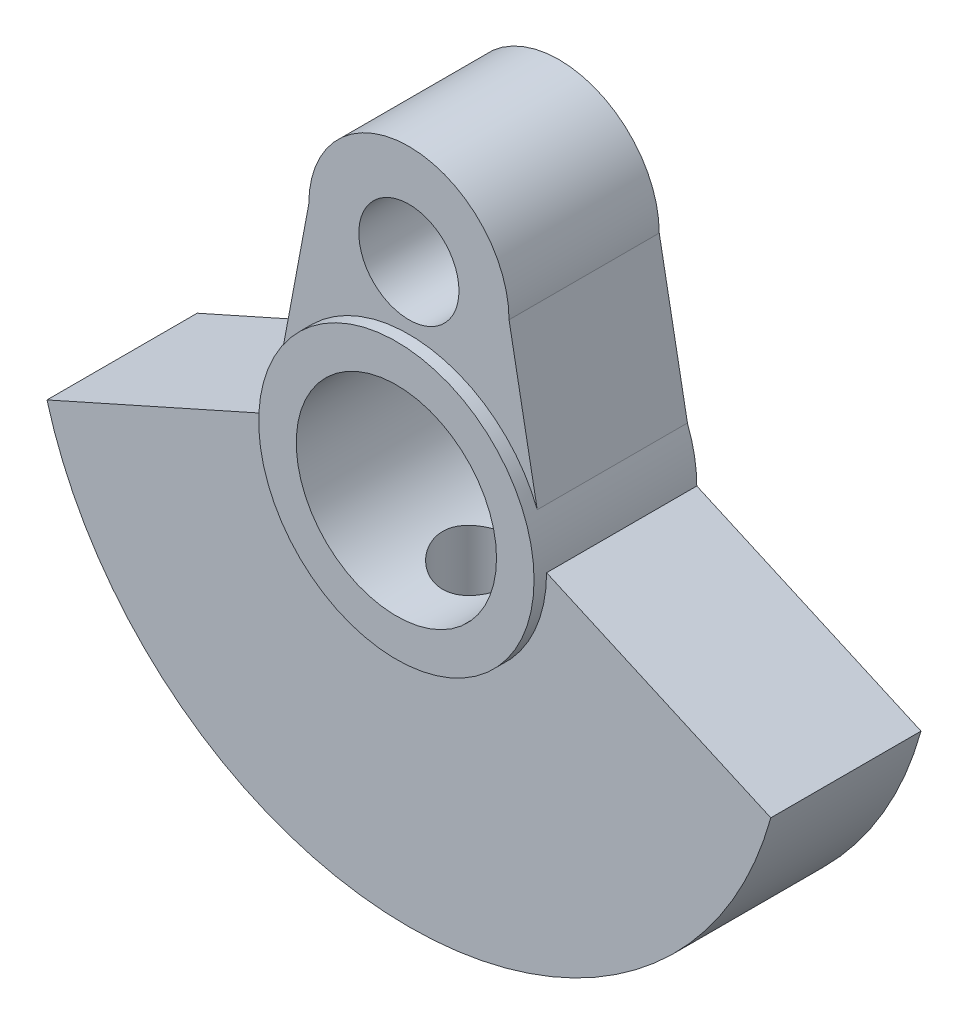
ISO-10303-21;
HEADER;
FILE_DESCRIPTION(('STEP AP214'),'2;1');
FILE_NAME('part.step','',(''),(''),'','','');
FILE_SCHEMA(('AUTOMOTIVE_DESIGN { 1 0 10303 214 1 1 1 1 }'));
ENDSEC;
DATA;
#1=APPLICATION_CONTEXT('core data for automotive mechanical design processes');
#2=APPLICATION_PROTOCOL_DEFINITION('international standard','automotive_design',2000,#1);
#3=PRODUCT_CONTEXT('',#1,'mechanical');
#4=PRODUCT('Part','Part','',(#3));
#5=PRODUCT_RELATED_PRODUCT_CATEGORY('part','',(#4));
#6=PRODUCT_DEFINITION_FORMATION('','',#4);
#7=PRODUCT_DEFINITION_CONTEXT('part definition',#1,'design');
#8=PRODUCT_DEFINITION('design','',#6,#7);
#9=PRODUCT_DEFINITION_SHAPE('','',#8);
#10=(LENGTH_UNIT() NAMED_UNIT(*) SI_UNIT(.MILLI.,.METRE.));
#11=(NAMED_UNIT(*) PLANE_ANGLE_UNIT() SI_UNIT($,.RADIAN.));
#12=(NAMED_UNIT(*) SI_UNIT($,.STERADIAN.) SOLID_ANGLE_UNIT());
#13=UNCERTAINTY_MEASURE_WITH_UNIT(LENGTH_MEASURE(1.E-05),#10,'distance_accuracy_value','');
#14=(GEOMETRIC_REPRESENTATION_CONTEXT(3) GLOBAL_UNCERTAINTY_ASSIGNED_CONTEXT((#13)) GLOBAL_UNIT_ASSIGNED_CONTEXT((#10,
#11,#12)) REPRESENTATION_CONTEXT('',''));
#15=CARTESIAN_POINT('',(0.,0.,0.));
#16=DIRECTION('',(0.,0.,1.));
#17=DIRECTION('',(1.,0.,0.));
#18=AXIS2_PLACEMENT_3D('',#15,#16,#17);
#19=CARTESIAN_POINT('',(5.31320754716981,0.996226415094339,6.));
#20=DIRECTION('',(0.982872186934322,0.184288535050185,0.));
#21=DIRECTION('',(-0.184288535050185,0.982872186934322,0.));
#22=AXIS2_PLACEMENT_3D('',#19,#20,#21);
#23=PLANE('',#22);
#24=DIRECTION('',(0.184288535050185,-0.982872186934322,0.));
#25=VECTOR('',#24,1.);
#26=CARTESIAN_POINT('',(5.31320754716981,0.996226415094339,0.));
#27=LINE('',#26,#25);
#28=CARTESIAN_POINT('',(4.,8.,0.));
#29=VERTEX_POINT('',#28);
#30=CARTESIAN_POINT('',(5.12641509433962,1.99245283018868,0.));
#31=VERTEX_POINT('',#30);
#32=EDGE_CURVE('E169',#29,#31,#27,.T.);
#33=ORIENTED_EDGE('',*,*,#32,.F.);
#34=DIRECTION('',(0.,0.,-1.));
#35=VECTOR('',#34,1.);
#36=CARTESIAN_POINT('',(4.,8.,6.));
#37=LINE('',#36,#35);
#38=CARTESIAN_POINT('',(4.,8.,6.));
#39=VERTEX_POINT('',#38);
#40=EDGE_CURVE('E66',#39,#29,#37,.T.);
#41=ORIENTED_EDGE('',*,*,#40,.F.);
#42=DIRECTION('',(0.184288535050185,-0.982872186934322,0.));
#43=VECTOR('',#42,1.);
#44=CARTESIAN_POINT('',(5.31320754716981,0.996226415094339,6.));
#45=LINE('',#44,#43);
#46=CARTESIAN_POINT('',(5.12641509433962,1.99245283018868,6.));
#47=VERTEX_POINT('',#46);
#48=EDGE_CURVE('E174',#39,#47,#45,.T.);
#49=ORIENTED_EDGE('',*,*,#48,.T.);
#50=DIRECTION('',(0.,0.,-1.));
#51=VECTOR('',#50,1.);
#52=CARTESIAN_POINT('',(5.12641509433962,1.99245283018868,6.));
#53=LINE('',#52,#51);
#54=EDGE_CURVE('E11',#47,#31,#53,.T.);
#55=ORIENTED_EDGE('',*,*,#54,.T.);
#56=EDGE_LOOP('',(#33,#41,#49,#55));
#57=FACE_BOUND('',#56,.T.);
#58=ADVANCED_FACE('F53',(#57),#23,.T.);
#59=CARTESIAN_POINT('',(0.,8.,6.));
#60=DIRECTION('',(0.,0.,-1.));
#61=DIRECTION('',(-1.,0.,0.));
#62=AXIS2_PLACEMENT_3D('',#59,#60,#61);
#63=CYLINDRICAL_SURFACE('',#62,4.);
#64=CARTESIAN_POINT('',(0.,8.,0.));
#65=DIRECTION('',(0.,0.,1.));
#66=DIRECTION('',(1.,0.,0.));
#67=AXIS2_PLACEMENT_3D('',#64,#65,#66);
#68=CIRCLE('',#67,4.);
#69=CARTESIAN_POINT('',(-4.,8.,0.));
#70=VERTEX_POINT('',#69);
#71=EDGE_CURVE('E189',#29,#70,#68,.T.);
#72=ORIENTED_EDGE('',*,*,#71,.T.);
#73=DIRECTION('',(0.,0.,-1.));
#74=VECTOR('',#73,1.);
#75=CARTESIAN_POINT('',(-4.,8.,6.));
#76=LINE('',#75,#74);
#77=CARTESIAN_POINT('',(-4.,8.,6.));
#78=VERTEX_POINT('',#77);
#79=EDGE_CURVE('E198',#78,#70,#76,.T.);
#80=ORIENTED_EDGE('',*,*,#79,.F.);
#81=CARTESIAN_POINT('',(0.,8.,6.));
#82=DIRECTION('',(0.,0.,1.));
#83=DIRECTION('',(1.,0.,0.));
#84=AXIS2_PLACEMENT_3D('',#81,#82,#83);
#85=CIRCLE('',#84,4.);
#86=EDGE_CURVE('E178',#39,#78,#85,.T.);
#87=ORIENTED_EDGE('',*,*,#86,.F.);
#88=ORIENTED_EDGE('',*,*,#40,.T.);
#89=EDGE_LOOP('',(#72,#80,#87,#88));
#90=FACE_BOUND('',#89,.T.);
#91=ADVANCED_FACE('F204',(#90),#63,.T.);
#92=CARTESIAN_POINT('',(-5.31320754716981,0.996226415094339,6.));
#93=DIRECTION('',(0.982872186934322,-0.184288535050185,0.));
#94=DIRECTION('',(0.184288535050185,0.982872186934322,0.));
#95=AXIS2_PLACEMENT_3D('',#92,#93,#94);
#96=PLANE('',#95);
#97=DIRECTION('',(-0.184288535050185,-0.982872186934322,0.));
#98=VECTOR('',#97,1.);
#99=CARTESIAN_POINT('',(-5.31320754716981,0.996226415094339,0.));
#100=LINE('',#99,#98);
#101=CARTESIAN_POINT('',(-5.12641509433962,1.99245283018868,0.));
#102=VERTEX_POINT('',#101);
#103=EDGE_CURVE('E191',#70,#102,#100,.T.);
#104=ORIENTED_EDGE('',*,*,#103,.T.);
#105=DIRECTION('',(0.,0.,-1.));
#106=VECTOR('',#105,1.);
#107=CARTESIAN_POINT('',(-5.12641509433962,1.99245283018868,6.));
#108=LINE('',#107,#106);
#109=CARTESIAN_POINT('',(-5.12641509433962,1.99245283018868,6.));
#110=VERTEX_POINT('',#109);
#111=EDGE_CURVE('E186',#110,#102,#108,.T.);
#112=ORIENTED_EDGE('',*,*,#111,.F.);
#113=DIRECTION('',(-0.184288535050185,-0.982872186934322,0.));
#114=VECTOR('',#113,1.);
#115=CARTESIAN_POINT('',(-5.31320754716981,0.996226415094339,6.));
#116=LINE('',#115,#114);
#117=EDGE_CURVE('E180',#78,#110,#116,.T.);
#118=ORIENTED_EDGE('',*,*,#117,.F.);
#119=ORIENTED_EDGE('',*,*,#79,.T.);
#120=EDGE_LOOP('',(#104,#112,#118,#119));
#121=FACE_BOUND('',#120,.T.);
#122=ADVANCED_FACE('F222',(#121),#96,.F.);
#123=CARTESIAN_POINT('',(0.,8.,6.));
#124=DIRECTION('',(0.,0.,-1.));
#125=DIRECTION('',(-1.,0.,0.));
#126=AXIS2_PLACEMENT_3D('',#123,#124,#125);
#127=CYLINDRICAL_SURFACE('',#126,2.);
#128=CARTESIAN_POINT('',(0.,8.,6.));
#129=DIRECTION('',(0.,0.,1.));
#130=DIRECTION('',(1.,0.,0.));
#131=AXIS2_PLACEMENT_3D('',#128,#129,#130);
#132=CIRCLE('',#131,2.);
#133=CARTESIAN_POINT('',(2.,8.,6.));
#134=VERTEX_POINT('',#133);
#135=EDGE_CURVE('E183',#134,#134,#132,.T.);
#136=ORIENTED_EDGE('',*,*,#135,.T.);
#137=EDGE_LOOP('',(#136));
#138=FACE_BOUND('',#137,.T.);
#139=CARTESIAN_POINT('',(0.,8.,0.));
#140=DIRECTION('',(0.,0.,1.));
#141=DIRECTION('',(1.,0.,0.));
#142=AXIS2_PLACEMENT_3D('',#139,#140,#141);
#143=CIRCLE('',#142,2.);
#144=CARTESIAN_POINT('',(2.,8.,0.));
#145=VERTEX_POINT('',#144);
#146=EDGE_CURVE('E175',#145,#145,#143,.T.);
#147=ORIENTED_EDGE('',*,*,#146,.F.);
#148=EDGE_LOOP('',(#147));
#149=FACE_BOUND('',#148,.T.);
#150=ADVANCED_FACE('F244',(#138,#149),#127,.F.);
#151=CARTESIAN_POINT('',(0.,0.,6.));
#152=DIRECTION('',(0.,0.,1.));
#153=DIRECTION('',(1.,0.,0.));
#154=AXIS2_PLACEMENT_3D('',#151,#152,#153);
#155=PLANE('',#154);
#156=CARTESIAN_POINT('',(0.,0.,6.));
#157=DIRECTION('',(0.,0.,1.));
#158=DIRECTION('',(1.,0.,0.));
#159=AXIS2_PLACEMENT_3D('',#156,#157,#158);
#160=CIRCLE('',#159,5.5);
#161=EDGE_CURVE('E172',#47,#110,#160,.T.);
#162=ORIENTED_EDGE('',*,*,#161,.F.);
#163=ORIENTED_EDGE('',*,*,#48,.F.);
#164=ORIENTED_EDGE('',*,*,#86,.T.);
#165=ORIENTED_EDGE('',*,*,#117,.T.);
#166=EDGE_LOOP('',(#162,#163,#164,#165));
#167=FACE_BOUND('',#166,.T.);
#168=ORIENTED_EDGE('',*,*,#135,.F.);
#169=EDGE_LOOP('',(#168));
#170=FACE_BOUND('',#169,.T.);
#171=ADVANCED_FACE('F217',(#167,#170),#155,.T.);
#172=CARTESIAN_POINT('',(0.,0.,0.));
#173=DIRECTION('',(0.,0.,1.));
#174=DIRECTION('',(1.,0.,0.));
#175=AXIS2_PLACEMENT_3D('',#172,#173,#174);
#176=PLANE('',#175);
#177=ORIENTED_EDGE('',*,*,#32,.T.);
#178=CARTESIAN_POINT('',(0.,0.,0.));
#179=DIRECTION('',(0.,0.,1.));
#180=DIRECTION('',(1.,0.,0.));
#181=AXIS2_PLACEMENT_3D('',#178,#179,#180);
#182=CIRCLE('',#181,5.5);
#183=CARTESIAN_POINT('',(5.5,0.,0.));
#184=VERTEX_POINT('',#183);
#185=EDGE_CURVE('E163',#184,#31,#182,.T.);
#186=ORIENTED_EDGE('',*,*,#185,.F.);
#187=DIRECTION('',(0.9130842111692,-0.40777104275993,0.));
#188=VECTOR('',#187,1.);
#189=CARTESIAN_POINT('',(0.914524728224361,2.04781115503851,0.));
#190=LINE('',#189,#188);
#191=CARTESIAN_POINT('',(14.456832294801,-4.,0.));
#192=VERTEX_POINT('',#191);
#193=EDGE_CURVE('E144',#184,#192,#190,.T.);
#194=ORIENTED_EDGE('',*,*,#193,.T.);
#195=CARTESIAN_POINT('',(0.,0.,0.));
#196=DIRECTION('',(0.,0.,1.));
#197=DIRECTION('',(1.,0.,0.));
#198=AXIS2_PLACEMENT_3D('',#195,#196,#197);
#199=CIRCLE('',#198,15.);
#200=CARTESIAN_POINT('',(-14.456832294801,-4.,0.));
#201=VERTEX_POINT('',#200);
#202=EDGE_CURVE('E151',#201,#192,#199,.T.);
#203=ORIENTED_EDGE('',*,*,#202,.F.);
#204=DIRECTION('',(0.9130842111692,0.407771042759929,0.));
#205=VECTOR('',#204,1.);
#206=CARTESIAN_POINT('',(-0.914524728224361,2.04781115503851,0.));
#207=LINE('',#206,#205);
#208=CARTESIAN_POINT('',(-5.5,0.,0.));
#209=VERTEX_POINT('',#208);
#210=EDGE_CURVE('E128',#201,#209,#207,.T.);
#211=ORIENTED_EDGE('',*,*,#210,.T.);
#212=EDGE_CURVE('E170',#102,#209,#182,.T.);
#213=ORIENTED_EDGE('',*,*,#212,.F.);
#214=ORIENTED_EDGE('',*,*,#103,.F.);
#215=ORIENTED_EDGE('',*,*,#71,.F.);
#216=EDGE_LOOP('',(#177,#186,#194,#203,#211,#213,#214,#215));
#217=FACE_BOUND('',#216,.T.);
#218=ORIENTED_EDGE('',*,*,#146,.T.);
#219=EDGE_LOOP('',(#218));
#220=FACE_BOUND('',#219,.T.);
#221=CARTESIAN_POINT('',(0.,0.,0.));
#222=DIRECTION('',(0.,0.,1.));
#223=DIRECTION('',(1.,0.,0.));
#224=AXIS2_PLACEMENT_3D('',#221,#222,#223);
#225=CIRCLE('',#224,4.);
#226=CARTESIAN_POINT('',(4.,0.,0.));
#227=VERTEX_POINT('',#226);
#228=EDGE_CURVE('E159',#227,#227,#225,.T.);
#229=ORIENTED_EDGE('',*,*,#228,.T.);
#230=EDGE_LOOP('',(#229));
#231=FACE_BOUND('',#230,.T.);
#232=ADVANCED_FACE('F211',(#217,#220,#231),#176,.F.);
#233=CARTESIAN_POINT('',(0.,0.,6.5));
#234=DIRECTION('',(0.,0.,1.));
#235=DIRECTION('',(1.,0.,0.));
#236=AXIS2_PLACEMENT_3D('',#233,#234,#235);
#237=PLANE('',#236);
#238=CARTESIAN_POINT('',(0.,0.,6.5));
#239=DIRECTION('',(0.,0.,1.));
#240=DIRECTION('',(1.,0.,0.));
#241=AXIS2_PLACEMENT_3D('',#238,#239,#240);
#242=CIRCLE('',#241,5.5);
#243=CARTESIAN_POINT('',(5.5,0.,6.5));
#244=VERTEX_POINT('',#243);
#245=EDGE_CURVE('E166',#244,#244,#242,.T.);
#246=ORIENTED_EDGE('',*,*,#245,.T.);
#247=EDGE_LOOP('',(#246));
#248=FACE_BOUND('',#247,.T.);
#249=CARTESIAN_POINT('',(0.,0.,6.5));
#250=DIRECTION('',(0.,0.,1.));
#251=DIRECTION('',(1.,0.,0.));
#252=AXIS2_PLACEMENT_3D('',#249,#250,#251);
#253=CIRCLE('',#252,4.);
#254=CARTESIAN_POINT('',(4.,0.,6.5));
#255=VERTEX_POINT('',#254);
#256=EDGE_CURVE('E160',#255,#255,#253,.T.);
#257=ORIENTED_EDGE('',*,*,#256,.F.);
#258=EDGE_LOOP('',(#257));
#259=FACE_BOUND('',#258,.T.);
#260=ADVANCED_FACE('F251',(#248,#259),#237,.T.);
#261=CARTESIAN_POINT('',(0.,0.,6.5));
#262=DIRECTION('',(0.,0.,-1.));
#263=DIRECTION('',(-1.,0.,0.));
#264=AXIS2_PLACEMENT_3D('',#261,#262,#263);
#265=CYLINDRICAL_SURFACE('',#264,5.5);
#266=ORIENTED_EDGE('',*,*,#212,.T.);
#267=DIRECTION('',(0.,0.,-1.));
#268=VECTOR('',#267,1.);
#269=CARTESIAN_POINT('',(-5.5,0.,6.));
#270=LINE('',#269,#268);
#271=CARTESIAN_POINT('',(-5.5,0.,6.));
#272=VERTEX_POINT('',#271);
#273=EDGE_CURVE('E78',#272,#209,#270,.T.);
#274=ORIENTED_EDGE('',*,*,#273,.F.);
#275=CARTESIAN_POINT('',(0.,0.,6.));
#276=DIRECTION('',(0.,0.,1.));
#277=DIRECTION('',(1.,0.,0.));
#278=AXIS2_PLACEMENT_3D('',#275,#276,#277);
#279=CIRCLE('',#278,5.5);
#280=CARTESIAN_POINT('',(5.5,0.,6.));
#281=VERTEX_POINT('',#280);
#282=EDGE_CURVE('E73',#272,#281,#279,.T.);
#283=ORIENTED_EDGE('',*,*,#282,.T.);
#284=DIRECTION('',(0.,0.,-1.));
#285=VECTOR('',#284,1.);
#286=CARTESIAN_POINT('',(5.5,0.,6.));
#287=LINE('',#286,#285);
#288=EDGE_CURVE('E149',#281,#184,#287,.T.);
#289=ORIENTED_EDGE('',*,*,#288,.T.);
#290=ORIENTED_EDGE('',*,*,#185,.T.);
#291=ORIENTED_EDGE('',*,*,#54,.F.);
#292=ORIENTED_EDGE('',*,*,#161,.T.);
#293=ORIENTED_EDGE('',*,*,#111,.T.);
#294=EDGE_LOOP('',(#266,#274,#283,#289,#290,#291,#292,#293));
#295=FACE_BOUND('',#294,.T.);
#296=ORIENTED_EDGE('',*,*,#245,.F.);
#297=EDGE_LOOP('',(#296));
#298=FACE_BOUND('',#297,.T.);
#299=ADVANCED_FACE('F214',(#295,#298),#265,.T.);
#300=CARTESIAN_POINT('',(0.,0.,6.5));
#301=DIRECTION('',(0.,0.,-1.));
#302=DIRECTION('',(-1.,0.,0.));
#303=AXIS2_PLACEMENT_3D('',#300,#301,#302);
#304=CYLINDRICAL_SURFACE('',#303,4.);
#305=CARTESIAN_POINT('',(0.,-4.,4.65));
#306=CARTESIAN_POINT('',(0.0884596783632791,-3.99999309817074,4.64999078279337));
#307=CARTESIAN_POINT('',(0.177062252057583,-3.99703145792172,4.64284398565668));
#308=CARTESIAN_POINT('',(0.351759669836409,-3.9854711320255,4.6145088580631));
#309=CARTESIAN_POINT('',(0.437847271996961,-3.97685757767606,4.59328348897568));
#310=CARTESIAN_POINT('',(0.604702496902741,-3.95491965529936,4.5377051877981));
#311=CARTESIAN_POINT('',(0.685486934491196,-3.94161112398211,4.50339635664654));
#312=CARTESIAN_POINT('',(0.840076633223487,-3.91158286286531,4.42280524215057));
#313=CARTESIAN_POINT('',(0.913884076117566,-3.89486420463244,4.37652671882984));
#314=CARTESIAN_POINT('',(1.05618769598525,-3.85876900012149,4.27089324535595));
#315=CARTESIAN_POINT('',(1.12429373957476,-3.83930654387258,4.21104232975103));
#316=CARTESIAN_POINT('',(1.24983574384757,-3.80029483347099,4.08101116034103));
#317=CARTESIAN_POINT('',(1.30726618926957,-3.78074553976622,4.01082560078819));
#318=CARTESIAN_POINT('',(1.41254826809049,-3.74272551686067,3.85803175112829));
#319=CARTESIAN_POINT('',(1.45980781790561,-3.72435159658093,3.77498888469348));
#320=CARTESIAN_POINT('',(1.53951358199407,-3.69212136090386,3.60126369070982));
#321=CARTESIAN_POINT('',(1.57196727712791,-3.67826276509115,3.51058524863699));
#322=CARTESIAN_POINT('',(1.61953738222492,-3.65756021871623,3.32865200299817));
#323=CARTESIAN_POINT('',(1.63540371417153,-3.65041449103236,3.23762892785693));
#324=CARTESIAN_POINT('',(1.65168918120803,-3.64307714795703,3.05395349263472));
#325=CARTESIAN_POINT('',(1.65211659474,-3.64288180572738,2.9613020323707));
#326=CARTESIAN_POINT('',(1.6380778077983,-3.64921138579605,2.78440111338128));
#327=CARTESIAN_POINT('',(1.62472398487459,-3.6552343974104,2.70004184125084));
#328=CARTESIAN_POINT('',(1.58536484231198,-3.67247532251837,2.53488971561883));
#329=CARTESIAN_POINT('',(1.55935715587185,-3.68369420783859,2.4540975323967));
#330=CARTESIAN_POINT('',(1.49492412942489,-3.71031458481431,2.29635489124138));
#331=CARTESIAN_POINT('',(1.45624866973017,-3.72579923184191,2.21952126219167));
#332=CARTESIAN_POINT('',(1.36775445443624,-3.75918616236907,2.07313976753997));
#333=CARTESIAN_POINT('',(1.31793135478159,-3.77708938726885,2.00359475775085));
#334=CARTESIAN_POINT('',(1.20371911924869,-3.81509742396095,1.86771359221219));
#335=CARTESIAN_POINT('',(1.13846630094389,-3.8352618825369,1.80211804229674));
#336=CARTESIAN_POINT('',(0.997682554866215,-3.87426910607353,1.68255532555862));
#337=CARTESIAN_POINT('',(0.922149319847433,-3.8931115728953,1.62859077613916));
#338=CARTESIAN_POINT('',(0.760736369737325,-3.92787932271737,1.53276522641496));
#339=CARTESIAN_POINT('',(0.674664094072237,-3.94373050716791,1.49119971680583));
#340=CARTESIAN_POINT('',(0.495928253552977,-3.97016319816605,1.42339697589113));
#341=CARTESIAN_POINT('',(0.403268287372386,-3.98074755693754,1.39715144678883));
#342=CARTESIAN_POINT('',(0.220181304317674,-3.99492450637935,1.36227049632178));
#343=CARTESIAN_POINT('',(0.129974172308222,-3.99891121146315,1.35264082206407));
#344=CARTESIAN_POINT('',(-0.0508474401522215,-4.00069746426785,1.3483079562367));
#345=CARTESIAN_POINT('',(-0.141461799500565,-3.99849874371343,1.35360058689178));
#346=CARTESIAN_POINT('',(-0.315907755487548,-3.98841747083847,1.37824526824296));
#347=CARTESIAN_POINT('',(-0.399855317526685,-3.9808153168881,1.39690407334009));
#348=CARTESIAN_POINT('',(-0.563340473329574,-3.96098887803091,1.44679209633711));
#349=CARTESIAN_POINT('',(-0.642877505872146,-3.94876400644332,1.47802290981479));
#350=CARTESIAN_POINT('',(-0.798061975964474,-3.92039728883464,1.55318937998089));
#351=CARTESIAN_POINT('',(-0.873512656660506,-3.90414585630856,1.59748856175622));
#352=CARTESIAN_POINT('',(-1.01617847320907,-3.86946768187548,1.69713393425787));
#353=CARTESIAN_POINT('',(-1.0833901834211,-3.85104004134398,1.75248469508984));
#354=CARTESIAN_POINT('',(-1.21261994292741,-3.8124029584454,1.87720430481197));
#355=CARTESIAN_POINT('',(-1.27394364561822,-3.79215916493832,1.9472838240393));
#356=CARTESIAN_POINT('',(-1.38414835482505,-3.75333928940831,2.09707129060853));
#357=CARTESIAN_POINT('',(-1.43302674162727,-3.73476355904109,2.17678125994255));
#358=CARTESIAN_POINT('',(-1.51742282291387,-3.70128700339843,2.34509537053331));
#359=CARTESIAN_POINT('',(-1.55275802936534,-3.68643724424496,2.43380191600806));
#360=CARTESIAN_POINT('',(-1.60769618165393,-3.66281640168181,2.61670916597824));
#361=CARTESIAN_POINT('',(-1.62731175174753,-3.65404044124936,2.71090539641817));
#362=CARTESIAN_POINT('',(-1.64901123940268,-3.64429559365239,2.89443027315806));
#363=CARTESIAN_POINT('',(-1.65231049364125,-3.64278573581523,2.98358721945794));
#364=CARTESIAN_POINT('',(-1.64451485356567,-3.64631178238903,3.16112847075918));
#365=CARTESIAN_POINT('',(-1.6334220656173,-3.65134672892696,3.24951288691937));
#366=CARTESIAN_POINT('',(-1.59817118006572,-3.666904904187,3.4189330712577));
#367=CARTESIAN_POINT('',(-1.57461958437454,-3.67717261200251,3.50012071142211));
#368=CARTESIAN_POINT('',(-1.51570599472927,-3.70184411206584,3.65741452247408));
#369=CARTESIAN_POINT('',(-1.48034069596893,-3.7162490615217,3.73351926429761));
#370=CARTESIAN_POINT('',(-1.3963806225379,-3.7486340889516,3.8834220382414));
#371=CARTESIAN_POINT('',(-1.34712443599271,-3.76677577854003,3.95681407102141));
#372=CARTESIAN_POINT('',(-1.23771718137822,-3.80412864636709,4.09467168726428));
#373=CARTESIAN_POINT('',(-1.17756245772962,-3.82334018195057,4.15913426277442));
#374=CARTESIAN_POINT('',(-1.04300738755744,-3.86230172013188,4.28199413870368));
#375=CARTESIAN_POINT('',(-0.967900110730176,-3.88199359359226,4.33963922360553));
#376=CARTESIAN_POINT('',(-0.808343463182034,-3.91832426905579,4.44154015953872));
#377=CARTESIAN_POINT('',(-0.723889843442851,-3.9349616732268,4.4857898863659));
#378=CARTESIAN_POINT('',(-0.549414760109628,-3.96305691394126,4.55866373983474));
#379=CARTESIAN_POINT('',(-0.459513381649426,-3.97459855421812,4.58754242535855));
#380=CARTESIAN_POINT('',(-0.275719229213243,-3.99154438775475,4.62951108478514));
#381=CARTESIAN_POINT('',(-0.181839966818031,-3.99696786149576,4.64265066624545));
#382=CARTESIAN_POINT('',(-0.0584442952271967,-3.99968194626838,4.64922677033004));
#383=CARTESIAN_POINT('',(-0.029229948670338,-4.00000228058839,4.65000304566421));
#384=CARTESIAN_POINT('',(0.,-4.,4.65));
#385=B_SPLINE_CURVE_WITH_KNOTS('',3,(#305,#306,#307,#308,#309,#310,#311,#312,#313,#314,#315,
#316,#317,#318,#319,#320,#321,#322,#323,#324,#325,#326,#327,#328,#329,#330,#331,#332,#333,#334,
#335,#336,#337,#338,#339,#340,#341,#342,#343,#344,#345,#346,#347,#348,#349,#350,#351,#352,#353,
#354,#355,#356,#357,#358,#359,#360,#361,#362,#363,#364,#365,#366,#367,#368,#369,#370,#371,#372,
#373,#374,#375,#376,#377,#378,#379,#380,#381,#382,#383,#384),.UNSPECIFIED.,.T.,.F.,(4,2,2,2,2,2,
2,2,2,2,2,2,2,2,2,2,2,2,2,2,2,2,2,2,2,2,2,2,2,2,2,2,2,2,2,2,2,2,2,4),(0.,0.26529709877062,
0.53129493790666,0.796403981498881,1.06142984766523,1.33841878994456,1.61555043582129,
1.90598404924538,2.19627075414925,2.47277648539421,2.7491339503796,3.00480633611683,
3.26052656166861,3.52163539301341,3.78284615202015,4.06565185095456,4.34852112528509,
4.63767392136376,4.92666995726767,5.19768149557686,5.46861716672805,5.72643264660554,
5.98428085748384,6.25011488704506,6.51605907418432,6.80064580250402,7.08529238632159,
7.37364985225781,7.66177550895676,7.92807823226724,8.19434198489785,8.4486977209856,
8.70312467109945,8.9726747998471,9.24231550885213,9.53104085816542,9.81989801073179,
10.1038095613048,10.3868238858899,10.4744866574818),.UNSPECIFIED.);
#386=CARTESIAN_POINT('',(0.,-4.,4.65));
#387=VERTEX_POINT('',#386);
#388=EDGE_CURVE('E152',#387,#387,#385,.T.);
#389=ORIENTED_EDGE('',*,*,#388,.F.);
#390=EDGE_LOOP('',(#389));
#391=FACE_BOUND('',#390,.T.);
#392=ORIENTED_EDGE('',*,*,#256,.T.);
#393=EDGE_LOOP('',(#392));
#394=FACE_BOUND('',#393,.T.);
#395=ORIENTED_EDGE('',*,*,#228,.F.);
#396=EDGE_LOOP('',(#395));
#397=FACE_BOUND('',#396,.T.);
#398=ADVANCED_FACE('F256',(#391,#394,#397),#304,.F.);
#399=CARTESIAN_POINT('',(-0.914524728224361,2.04781115503851,6.));
#400=DIRECTION('',(-0.407771042759929,0.9130842111692,0.));
#401=DIRECTION('',(-0.9130842111692,-0.407771042759929,0.));
#402=AXIS2_PLACEMENT_3D('',#399,#400,#401);
#403=PLANE('',#402);
#404=ORIENTED_EDGE('',*,*,#210,.F.);
#405=DIRECTION('',(0.,0.,-1.));
#406=VECTOR('',#405,1.);
#407=CARTESIAN_POINT('',(-14.456832294801,-4.,6.));
#408=LINE('',#407,#406);
#409=CARTESIAN_POINT('',(-14.456832294801,-4.,6.));
#410=VERTEX_POINT('',#409);
#411=EDGE_CURVE('E122',#410,#201,#408,.T.);
#412=ORIENTED_EDGE('',*,*,#411,.F.);
#413=DIRECTION('',(0.9130842111692,0.407771042759929,0.));
#414=VECTOR('',#413,1.);
#415=CARTESIAN_POINT('',(-0.914524728224361,2.04781115503851,6.));
#416=LINE('',#415,#414);
#417=EDGE_CURVE('E126',#410,#272,#416,.T.);
#418=ORIENTED_EDGE('',*,*,#417,.T.);
#419=ORIENTED_EDGE('',*,*,#273,.T.);
#420=EDGE_LOOP('',(#404,#412,#418,#419));
#421=FACE_BOUND('',#420,.T.);
#422=ADVANCED_FACE('F124',(#421),#403,.T.);
#423=CARTESIAN_POINT('',(0.,0.,6.));
#424=DIRECTION('',(0.,0.,-1.));
#425=DIRECTION('',(-1.,0.,0.));
#426=AXIS2_PLACEMENT_3D('',#423,#424,#425);
#427=CYLINDRICAL_SURFACE('',#426,15.);
#428=CARTESIAN_POINT('',(0.,-15.,4.65));
#429=CARTESIAN_POINT('',(0.0923818218581746,-14.9999988431375,4.64999602592176));
#430=CARTESIAN_POINT('',(0.184823472950829,-14.9991375118722,4.64221531734205));
#431=CARTESIAN_POINT('',(0.36714038463706,-14.9957843241747,4.61129600565167));
#432=CARTESIAN_POINT('',(0.457012763410701,-14.9932907064293,4.58814081236634));
#433=CARTESIAN_POINT('',(0.631524868732986,-14.9869542195955,4.52715786204555));
#434=CARTESIAN_POINT('',(0.716167852564645,-14.9831122005694,4.48933934752697));
#435=CARTESIAN_POINT('',(0.877887506534781,-14.9745076566348,4.40012210952094));
#436=CARTESIAN_POINT('',(0.954965599904044,-14.9697453053767,4.34872594722537));
#437=CARTESIAN_POINT('',(1.09971749291982,-14.9598099458213,4.23357486983765));
#438=CARTESIAN_POINT('',(1.16735402776654,-14.9546354302355,4.16977323615296));
#439=CARTESIAN_POINT('',(1.29098229654243,-14.9444712876292,4.03172228204051));
#440=CARTESIAN_POINT('',(1.34697347210661,-14.9394816694836,3.95747246093512));
#441=CARTESIAN_POINT('',(1.44585644392366,-14.9302371294103,3.8003958830293));
#442=CARTESIAN_POINT('',(1.4887140314528,-14.9259841384625,3.71754746772097));
#443=CARTESIAN_POINT('',(1.55989482430128,-14.9187136159983,3.54577515324948));
#444=CARTESIAN_POINT('',(1.58821845988081,-14.9156960479094,3.45685143402672));
#445=CARTESIAN_POINT('',(1.62941572162321,-14.9112520065666,3.27583568675802));
#446=CARTESIAN_POINT('',(1.64235163484851,-14.9098191204392,3.18375799470502));
#447=CARTESIAN_POINT('',(1.65259886462404,-14.908686898868,2.99872818575008));
#448=CARTESIAN_POINT('',(1.64991067288424,-14.908987508869,2.90577609645843));
#449=CARTESIAN_POINT('',(1.62903725829947,-14.9112824512349,2.72206718093308));
#450=CARTESIAN_POINT('',(1.61092026760878,-14.9132693261476,2.63130249570011));
#451=CARTESIAN_POINT('',(1.55980980676325,-14.9187012894236,2.45410973077232));
#452=CARTESIAN_POINT('',(1.52681609784369,-14.9221464011908,2.36768172070394));
#453=CARTESIAN_POINT('',(1.44681419634299,-14.9301152023445,2.20140147040344));
#454=CARTESIAN_POINT('',(1.39977596429643,-14.9346411994129,2.1215637980601));
#455=CARTESIAN_POINT('',(1.29304180674751,-14.944259925937,1.97089001586857));
#456=CARTESIAN_POINT('',(1.23334543269006,-14.9493526754732,1.90005422515419));
#457=CARTESIAN_POINT('',(1.10260955971916,-14.9595642939927,1.76899864707261));
#458=CARTESIAN_POINT('',(1.03151117609732,-14.9646831571922,1.70883758470399));
#459=CARTESIAN_POINT('',(0.880193329427119,-14.9743446474524,1.60129515396914));
#460=CARTESIAN_POINT('',(0.799973852605644,-14.978887273643,1.55391380490099));
#461=CARTESIAN_POINT('',(0.6326485491733,-14.9868864198642,1.47327724493409));
#462=CARTESIAN_POINT('',(0.545541148541531,-14.9903426907391,1.44002527399497));
#463=CARTESIAN_POINT('',(0.366932993265997,-14.9957772807096,1.38863574371619));
#464=CARTESIAN_POINT('',(0.275432397824438,-14.9977556533188,1.37049763711131));
#465=CARTESIAN_POINT('',(0.0911434787578456,-15.0000046359516,1.34992581140619));
#466=CARTESIAN_POINT('',(-0.00163570174845562,-15.0002840523084,1.34741110880781));
#467=CARTESIAN_POINT('',(-0.186294166416552,-14.9991273146614,1.35794439372984));
#468=CARTESIAN_POINT('',(-0.278173465315143,-14.9976911887995,1.37099212596293));
#469=CARTESIAN_POINT('',(-0.45818836055987,-14.9932703044021,1.41221268113863));
#470=CARTESIAN_POINT('',(-0.546332803398984,-14.9902894555646,1.4403473252895));
#471=CARTESIAN_POINT('',(-0.716651536032794,-14.9831132635213,1.51090365939588));
#472=CARTESIAN_POINT('',(-0.798825665625388,-14.9789178877409,1.55332573255563));
#473=CARTESIAN_POINT('',(-0.955235638443858,-14.9697593637147,1.6514517217393));
#474=CARTESIAN_POINT('',(-1.02943811324488,-14.9647931858517,1.70720853862969));
#475=CARTESIAN_POINT('',(-1.1674600255377,-14.9546593253991,1.83034581367705));
#476=CARTESIAN_POINT('',(-1.23127914630015,-14.9494916366686,1.89772662627825));
#477=CARTESIAN_POINT('',(-1.34700625191035,-14.9395104302445,2.04255383820739));
#478=CARTESIAN_POINT('',(-1.39886088486303,-14.9346985615749,2.12004299930937));
#479=CARTESIAN_POINT('',(-1.48881961499013,-14.9259997112416,2.28267764792179));
#480=CARTESIAN_POINT('',(-1.52692393381705,-14.9221127146694,2.36782301198803));
#481=CARTESIAN_POINT('',(-1.5882121698463,-14.9157144017887,2.54317418969728));
#482=CARTESIAN_POINT('',(-1.61142720744416,-14.913200217783,2.63336901720494));
#483=CARTESIAN_POINT('',(-1.64237859902929,-14.9098235690547,2.81640577998525));
#484=CARTESIAN_POINT('',(-1.65011549909774,-14.9089610460603,2.90924762175188));
#485=CARTESIAN_POINT('',(-1.64988250778876,-14.9089867901201,3.0944125396664));
#486=CARTESIAN_POINT('',(-1.64199642382743,-14.9098657154103,3.18673573391973));
#487=CARTESIAN_POINT('',(-1.61091769726742,-14.9132553441701,3.36873678635711));
#488=CARTESIAN_POINT('',(-1.58772504262742,-14.9157660489234,3.45841464246007));
#489=CARTESIAN_POINT('',(-1.52671583943657,-14.9221336424926,3.63257481317614));
#490=CARTESIAN_POINT('',(-1.48890235332836,-14.9259902493827,3.71705821151518));
#491=CARTESIAN_POINT('',(-1.39973329169088,-14.9346156407071,3.8784931384346));
#492=CARTESIAN_POINT('',(-1.34837769938871,-14.9393844262711,3.95544465768603));
#493=CARTESIAN_POINT('',(-1.23326864168925,-14.9493275259266,4.1000607296797));
#494=CARTESIAN_POINT('',(-1.16945266430597,-14.9545038027611,4.16767539235068));
#495=CARTESIAN_POINT('',(-1.03136150958025,-14.9646609076263,4.29127092100456));
#496=CARTESIAN_POINT('',(-0.957083846303532,-14.969641688842,4.34724901402362));
#497=CARTESIAN_POINT('',(-0.799929681435436,-14.9788625057048,4.44611876670879));
#498=CARTESIAN_POINT('',(-0.717028162742395,-14.9831002847694,4.48897084583364));
#499=CARTESIAN_POINT('',(-0.545209885523749,-14.9903338724846,4.56008722850784));
#500=CARTESIAN_POINT('',(-0.456299942937419,-14.993331061833,4.58836775789974));
#501=CARTESIAN_POINT('',(-0.305751892942927,-14.9970040251543,4.62259125766417));
#502=CARTESIAN_POINT('',(-0.245071615108731,-14.9981221898992,4.6328552237871));
#503=CARTESIAN_POINT('',(-0.122936388450104,-14.9996205603388,4.64656089944539));
#504=CARTESIAN_POINT('',(-0.0614814436954415,-15.0000007699088,4.65000264480676));
#505=CARTESIAN_POINT('',(0.,-15.,4.65));
#506=B_SPLINE_CURVE_WITH_KNOTS('',3,(#428,#429,#430,#431,#432,#433,#434,#435,#436,#437,#438,
#439,#440,#441,#442,#443,#444,#445,#446,#447,#448,#449,#450,#451,#452,#453,#454,#455,#456,#457,
#458,#459,#460,#461,#462,#463,#464,#465,#466,#467,#468,#469,#470,#471,#472,#473,#474,#475,#476,
#477,#478,#479,#480,#481,#482,#483,#484,#485,#486,#487,#488,#489,#490,#491,#492,#493,#494,#495,
#496,#497,#498,#499,#500,#501,#502,#503,#504,#505),.UNSPECIFIED.,.T.,.F.,(4,2,2,2,2,2,2,2,2,2,2,
2,2,2,2,2,2,2,2,2,2,2,2,2,2,2,2,2,2,2,2,2,2,2,2,2,2,2,4),(0.,0.276920934615254,
0.554141173519899,0.831186959564196,1.10818052291128,1.38623817794144,1.66430916204826,
1.94309839229293,2.22187936884105,2.49952800190879,2.77716789707699,3.05358629881208,
3.33000913709782,3.60702749676351,3.88405567451859,4.16256356312762,4.44107187229719,
4.71964401084108,4.99820606199367,5.27532298117503,5.55243535457279,5.82884975677338,
6.10527157329622,6.3828087371903,6.66035436537182,6.93911468163529,7.21787050413385,
7.49604177805968,7.77420323770547,8.0508765774938,8.32755013493493,8.60416577239309,
8.88078175246171,9.15882288790671,9.43693020406013,9.71586805930811,9.99449463424157,
10.1787905045231,10.3630854069962),.UNSPECIFIED.);
#507=CARTESIAN_POINT('',(0.,-15.,4.65));
#508=VERTEX_POINT('',#507);
#509=EDGE_CURVE('E56',#508,#508,#506,.T.);
#510=ORIENTED_EDGE('',*,*,#509,.T.);
#511=EDGE_LOOP('',(#510));
#512=FACE_BOUND('',#511,.T.);
#513=ORIENTED_EDGE('',*,*,#202,.T.);
#514=DIRECTION('',(0.,0.,-1.));
#515=VECTOR('',#514,1.);
#516=CARTESIAN_POINT('',(14.456832294801,-4.,6.));
#517=LINE('',#516,#515);
#518=CARTESIAN_POINT('',(14.456832294801,-4.,6.));
#519=VERTEX_POINT('',#518);
#520=EDGE_CURVE('E132',#519,#192,#517,.T.);
#521=ORIENTED_EDGE('',*,*,#520,.F.);
#522=CARTESIAN_POINT('',(0.,0.,6.));
#523=DIRECTION('',(0.,0.,1.));
#524=DIRECTION('',(1.,0.,0.));
#525=AXIS2_PLACEMENT_3D('',#522,#523,#524);
#526=CIRCLE('',#525,15.);
#527=EDGE_CURVE('E135',#410,#519,#526,.T.);
#528=ORIENTED_EDGE('',*,*,#527,.F.);
#529=ORIENTED_EDGE('',*,*,#411,.T.);
#530=EDGE_LOOP('',(#513,#521,#528,#529));
#531=FACE_BOUND('',#530,.T.);
#532=ADVANCED_FACE('F136',(#512,#531),#427,.T.);
#533=CARTESIAN_POINT('',(0.914524728224361,2.04781115503851,6.));
#534=DIRECTION('',(0.407771042759929,0.9130842111692,0.));
#535=DIRECTION('',(-0.9130842111692,0.40777104275993,0.));
#536=AXIS2_PLACEMENT_3D('',#533,#534,#535);
#537=PLANE('',#536);
#538=ORIENTED_EDGE('',*,*,#193,.F.);
#539=ORIENTED_EDGE('',*,*,#288,.F.);
#540=DIRECTION('',(0.9130842111692,-0.40777104275993,0.));
#541=VECTOR('',#540,1.);
#542=CARTESIAN_POINT('',(0.914524728224361,2.04781115503851,6.));
#543=LINE('',#542,#541);
#544=EDGE_CURVE('E140',#281,#519,#543,.T.);
#545=ORIENTED_EDGE('',*,*,#544,.T.);
#546=ORIENTED_EDGE('',*,*,#520,.T.);
#547=EDGE_LOOP('',(#538,#539,#545,#546));
#548=FACE_BOUND('',#547,.T.);
#549=ADVANCED_FACE('F225',(#548),#537,.T.);
#550=CARTESIAN_POINT('',(0.,0.,6.));
#551=DIRECTION('',(0.,0.,1.));
#552=DIRECTION('',(1.,0.,0.));
#553=AXIS2_PLACEMENT_3D('',#550,#551,#552);
#554=PLANE('',#553);
#555=ORIENTED_EDGE('',*,*,#282,.F.);
#556=ORIENTED_EDGE('',*,*,#417,.F.);
#557=ORIENTED_EDGE('',*,*,#527,.T.);
#558=ORIENTED_EDGE('',*,*,#544,.F.);
#559=EDGE_LOOP('',(#555,#556,#557,#558));
#560=FACE_BOUND('',#559,.T.);
#561=ADVANCED_FACE('F142',(#560),#554,.T.);
#562=CARTESIAN_POINT('',(0.,0.,3.));
#563=DIRECTION('',(0.,1.,0.));
#564=DIRECTION('',(0.,0.,1.));
#565=AXIS2_PLACEMENT_3D('',#562,#563,#564);
#566=CYLINDRICAL_SURFACE('',#565,1.65);
#567=ORIENTED_EDGE('',*,*,#388,.T.);
#568=EDGE_LOOP('',(#567));
#569=FACE_BOUND('',#568,.T.);
#570=ORIENTED_EDGE('',*,*,#509,.F.);
#571=EDGE_LOOP('',(#570));
#572=FACE_BOUND('',#571,.T.);
#573=ADVANCED_FACE('F232',(#569,#572),#566,.F.);
#574=CLOSED_SHELL('',(#58,#91,#122,#150,#171,#232,#260,#299,#398,#422,#532,#549,#561,#573));
#575=MANIFOLD_SOLID_BREP('B2',#574);
#576=ADVANCED_BREP_SHAPE_REPRESENTATION('',(#18,#575),#14);
#577=SHAPE_DEFINITION_REPRESENTATION(#9,#576);
ENDSEC;
END-ISO-10303-21;
